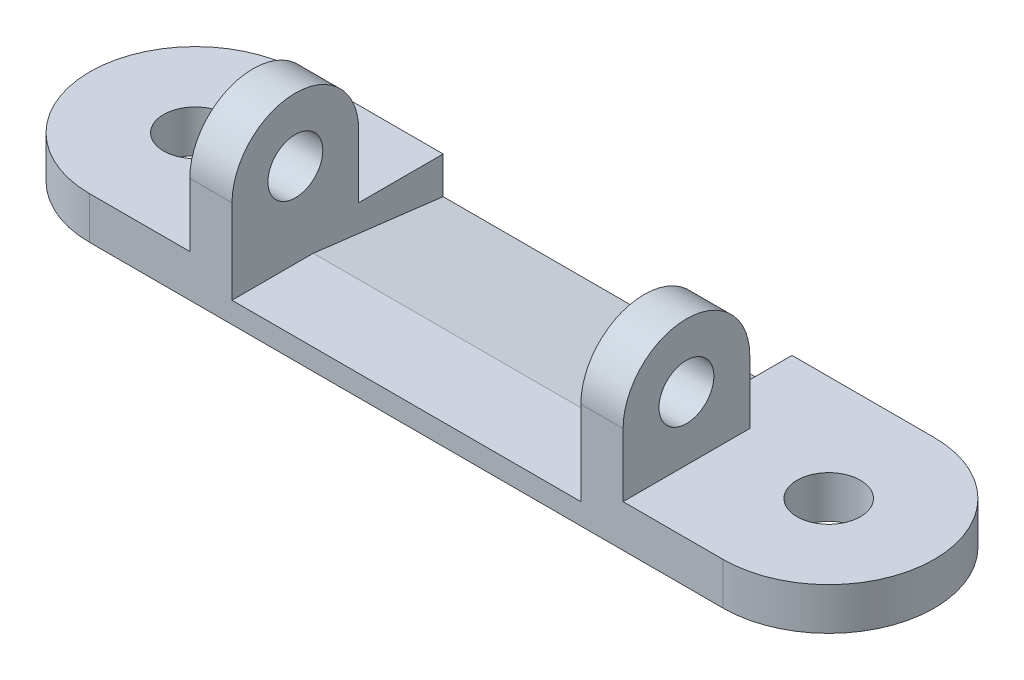
ISO-10303-21;
HEADER;
FILE_DESCRIPTION(('STEP AP214'),'2;1');
FILE_NAME('part.step','',(''),(''),'','','');
FILE_SCHEMA(('AUTOMOTIVE_DESIGN { 1 0 10303 214 1 1 1 1 }'));
ENDSEC;
DATA;
#1=APPLICATION_CONTEXT('core data for automotive mechanical design processes');
#2=APPLICATION_PROTOCOL_DEFINITION('international standard','automotive_design',2000,#1);
#3=PRODUCT_CONTEXT('',#1,'mechanical');
#4=PRODUCT('Part','Part','',(#3));
#5=PRODUCT_RELATED_PRODUCT_CATEGORY('part','',(#4));
#6=PRODUCT_DEFINITION_FORMATION('','',#4);
#7=PRODUCT_DEFINITION_CONTEXT('part definition',#1,'design');
#8=PRODUCT_DEFINITION('design','',#6,#7);
#9=PRODUCT_DEFINITION_SHAPE('','',#8);
#10=(LENGTH_UNIT() NAMED_UNIT(*) SI_UNIT(.MILLI.,.METRE.));
#11=(NAMED_UNIT(*) PLANE_ANGLE_UNIT() SI_UNIT($,.RADIAN.));
#12=(NAMED_UNIT(*) SI_UNIT($,.STERADIAN.) SOLID_ANGLE_UNIT());
#13=UNCERTAINTY_MEASURE_WITH_UNIT(LENGTH_MEASURE(1.E-05),#10,'distance_accuracy_value','');
#14=(GEOMETRIC_REPRESENTATION_CONTEXT(3) GLOBAL_UNCERTAINTY_ASSIGNED_CONTEXT((#13)) GLOBAL_UNIT_ASSIGNED_CONTEXT((#10,
#11,#12)) REPRESENTATION_CONTEXT('',''));
#15=CARTESIAN_POINT('',(0.,0.,0.));
#16=DIRECTION('',(0.,0.,1.));
#17=DIRECTION('',(1.,0.,0.));
#18=AXIS2_PLACEMENT_3D('',#15,#16,#17);
#19=CARTESIAN_POINT('',(20.5227116418583,-16.2835569799683,4.));
#20=DIRECTION('',(-1.,0.,0.));
#21=DIRECTION('',(0.,0.,1.));
#22=AXIS2_PLACEMENT_3D('',#19,#20,#21);
#23=PLANE('',#22);
#24=DIRECTION('',(0.,0.,1.));
#25=VECTOR('',#24,1.);
#26=CARTESIAN_POINT('',(20.5227116418583,4.,9.99999999999999));
#27=LINE('',#26,#25);
#28=CARTESIAN_POINT('',(20.5227116418583,4.,-2.00000000000001));
#29=VERTEX_POINT('',#28);
#30=CARTESIAN_POINT('',(20.5227116418583,4.,9.99999999999999));
#31=VERTEX_POINT('',#30);
#32=EDGE_CURVE('E211',#29,#31,#27,.T.);
#33=ORIENTED_EDGE('',*,*,#32,.F.);
#34=DIRECTION('',(0.,-1.,0.));
#35=VECTOR('',#34,1.);
#36=CARTESIAN_POINT('',(20.5227116418583,4.,-2.00000000000001));
#37=LINE('',#36,#35);
#38=CARTESIAN_POINT('',(20.5227116418583,10.,-2.00000000000001));
#39=VERTEX_POINT('',#38);
#40=EDGE_CURVE('E226',#39,#29,#37,.T.);
#41=ORIENTED_EDGE('',*,*,#40,.F.);
#42=CARTESIAN_POINT('',(20.5227116418583,10.,3.99999999999999));
#43=DIRECTION('',(-1.,0.,0.));
#44=DIRECTION('',(0.,0.,1.));
#45=AXIS2_PLACEMENT_3D('',#42,#43,#44);
#46=CIRCLE('',#45,6.);
#47=CARTESIAN_POINT('',(20.5227116418583,10.,9.99999999999999));
#48=VERTEX_POINT('',#47);
#49=EDGE_CURVE('E194',#48,#39,#46,.T.);
#50=ORIENTED_EDGE('',*,*,#49,.F.);
#51=DIRECTION('',(0.,1.,0.));
#52=VECTOR('',#51,1.);
#53=CARTESIAN_POINT('',(20.5227116418583,4.,9.99999999999999));
#54=LINE('',#53,#52);
#55=EDGE_CURVE('E197',#31,#48,#54,.T.);
#56=ORIENTED_EDGE('',*,*,#55,.F.);
#57=EDGE_LOOP('',(#33,#41,#50,#56));
#58=FACE_BOUND('',#57,.T.);
#59=CARTESIAN_POINT('',(20.5227116418583,10.,3.99999999999999));
#60=DIRECTION('',(-1.,0.,0.));
#61=DIRECTION('',(0.,0.,1.));
#62=AXIS2_PLACEMENT_3D('',#59,#60,#61);
#63=CIRCLE('',#62,2.6);
#64=CARTESIAN_POINT('',(20.5227116418583,10.,6.59999999999999));
#65=VERTEX_POINT('',#64);
#66=EDGE_CURVE('E191',#65,#65,#63,.F.);
#67=ORIENTED_EDGE('',*,*,#66,.F.);
#68=EDGE_LOOP('',(#67));
#69=FACE_BOUND('',#68,.T.);
#70=ADVANCED_FACE('F37',(#58,#69),#23,.F.);
#71=CARTESIAN_POINT('',(16.5227116418583,-16.2835569799683,4.));
#72=DIRECTION('',(-1.,0.,0.));
#73=DIRECTION('',(0.,0.,1.));
#74=AXIS2_PLACEMENT_3D('',#71,#72,#73);
#75=PLANE('',#74);
#76=DIRECTION('',(0.,-1.,0.));
#77=VECTOR('',#76,1.);
#78=CARTESIAN_POINT('',(16.5227116418583,4.,-2.00000000000001));
#79=LINE('',#78,#77);
#80=CARTESIAN_POINT('',(16.5227116418583,10.,-2.00000000000001));
#81=VERTEX_POINT('',#80);
#82=CARTESIAN_POINT('',(16.5227116418583,4.,-2.00000000000001));
#83=VERTEX_POINT('',#82);
#84=EDGE_CURVE('E222',#81,#83,#79,.T.);
#85=ORIENTED_EDGE('',*,*,#84,.T.);
#86=DIRECTION('',(0.,0.,1.));
#87=VECTOR('',#86,1.);
#88=CARTESIAN_POINT('',(16.5227116418583,4.,0.));
#89=LINE('',#88,#87);
#90=CARTESIAN_POINT('',(16.5227116418583,4.,-10.));
#91=VERTEX_POINT('',#90);
#92=EDGE_CURVE('E175',#91,#83,#89,.T.);
#93=ORIENTED_EDGE('',*,*,#92,.F.);
#94=DIRECTION('',(0.,1.,0.));
#95=VECTOR('',#94,1.);
#96=CARTESIAN_POINT('',(16.5227116418583,4.,-10.));
#97=LINE('',#96,#95);
#98=CARTESIAN_POINT('',(16.5227116418583,0.5,-10.));
#99=VERTEX_POINT('',#98);
#100=EDGE_CURVE('E181',#99,#91,#97,.T.);
#101=ORIENTED_EDGE('',*,*,#100,.F.);
#102=DIRECTION('',(0.,0.12105437531104,0.992645877550526));
#103=VECTOR('',#102,1.);
#104=CARTESIAN_POINT('',(16.5227116418583,2.,2.29999999999999));
#105=LINE('',#104,#103);
#106=CARTESIAN_POINT('',(16.5227116418583,2.,2.29999999999999));
#107=VERTEX_POINT('',#106);
#108=EDGE_CURVE('E161',#99,#107,#105,.T.);
#109=ORIENTED_EDGE('',*,*,#108,.T.);
#110=DIRECTION('',(0.,0.,1.));
#111=VECTOR('',#110,1.);
#112=CARTESIAN_POINT('',(16.5227116418583,2.,9.99999999999999));
#113=LINE('',#112,#111);
#114=CARTESIAN_POINT('',(16.5227116418583,2.,9.99999999999999));
#115=VERTEX_POINT('',#114);
#116=EDGE_CURVE('E170',#107,#115,#113,.T.);
#117=ORIENTED_EDGE('',*,*,#116,.T.);
#118=DIRECTION('',(0.,1.,0.));
#119=VECTOR('',#118,1.);
#120=CARTESIAN_POINT('',(16.5227116418583,4.,9.99999999999999));
#121=LINE('',#120,#119);
#122=CARTESIAN_POINT('',(16.5227116418583,10.,9.99999999999999));
#123=VERTEX_POINT('',#122);
#124=EDGE_CURVE('E195',#115,#123,#121,.T.);
#125=ORIENTED_EDGE('',*,*,#124,.T.);
#126=CARTESIAN_POINT('',(16.5227116418583,10.,3.99999999999999));
#127=DIRECTION('',(-1.,0.,0.));
#128=DIRECTION('',(0.,0.,1.));
#129=AXIS2_PLACEMENT_3D('',#126,#127,#128);
#130=CIRCLE('',#129,6.);
#131=EDGE_CURVE('E203',#123,#81,#130,.T.);
#132=ORIENTED_EDGE('',*,*,#131,.T.);
#133=EDGE_LOOP('',(#85,#93,#101,#109,#117,#125,#132));
#134=FACE_BOUND('',#133,.T.);
#135=CARTESIAN_POINT('',(16.5227116418583,10.,3.99999999999999));
#136=DIRECTION('',(1.,0.,0.));
#137=DIRECTION('',(0.,0.,-1.));
#138=AXIS2_PLACEMENT_3D('',#135,#136,#137);
#139=CIRCLE('',#138,2.6);
#140=CARTESIAN_POINT('',(16.5227116418583,10.,1.4));
#141=VERTEX_POINT('',#140);
#142=EDGE_CURVE('E188',#141,#141,#139,.T.);
#143=ORIENTED_EDGE('',*,*,#142,.T.);
#144=EDGE_LOOP('',(#143));
#145=FACE_BOUND('',#144,.T.);
#146=ADVANCED_FACE('F179',(#134,#145),#75,.T.);
#147=CARTESIAN_POINT('',(30.,4.,0.));
#148=DIRECTION('',(0.,-1.,0.));
#149=DIRECTION('',(0.,0.,-1.));
#150=AXIS2_PLACEMENT_3D('',#147,#148,#149);
#151=PLANE('',#150);
#152=CARTESIAN_POINT('',(30.,4.,0.));
#153=DIRECTION('',(0.,1.,0.));
#154=DIRECTION('',(0.,0.,1.));
#155=AXIS2_PLACEMENT_3D('',#152,#153,#154);
#156=CIRCLE('',#155,3.);
#157=CARTESIAN_POINT('',(30.,4.,2.99999999999999));
#158=VERTEX_POINT('',#157);
#159=EDGE_CURVE('E259',#158,#158,#156,.T.);
#160=ORIENTED_EDGE('',*,*,#159,.F.);
#161=EDGE_LOOP('',(#160));
#162=FACE_BOUND('',#161,.T.);
#163=DIRECTION('',(-1.,0.,0.));
#164=VECTOR('',#163,1.);
#165=CARTESIAN_POINT('',(-30.,4.,-10.));
#166=LINE('',#165,#164);
#167=CARTESIAN_POINT('',(30.,4.,-10.));
#168=VERTEX_POINT('',#167);
#169=EDGE_CURVE('E90',#168,#91,#166,.T.);
#170=ORIENTED_EDGE('',*,*,#169,.T.);
#171=ORIENTED_EDGE('',*,*,#92,.T.);
#172=DIRECTION('',(1.,0.,0.));
#173=VECTOR('',#172,1.);
#174=CARTESIAN_POINT('',(16.5227116418583,4.,-2.00000000000001));
#175=LINE('',#174,#173);
#176=EDGE_CURVE('E55',#83,#29,#175,.T.);
#177=ORIENTED_EDGE('',*,*,#176,.T.);
#178=ORIENTED_EDGE('',*,*,#32,.T.);
#179=DIRECTION('',(1.,0.,0.));
#180=VECTOR('',#179,1.);
#181=CARTESIAN_POINT('',(-30.,4.,9.99999999999999));
#182=LINE('',#181,#180);
#183=CARTESIAN_POINT('',(30.,4.,9.99999999999999));
#184=VERTEX_POINT('',#183);
#185=EDGE_CURVE('E41',#31,#184,#182,.T.);
#186=ORIENTED_EDGE('',*,*,#185,.T.);
#187=CARTESIAN_POINT('',(30.,4.,0.));
#188=DIRECTION('',(0.,1.,0.));
#189=DIRECTION('',(0.,0.,-1.));
#190=AXIS2_PLACEMENT_3D('',#187,#188,#189);
#191=CIRCLE('',#190,10.);
#192=EDGE_CURVE('E314',#184,#168,#191,.T.);
#193=ORIENTED_EDGE('',*,*,#192,.T.);
#194=EDGE_LOOP('',(#170,#171,#177,#178,#186,#193));
#195=FACE_BOUND('',#194,.T.);
#196=ADVANCED_FACE('F362',(#162,#195),#151,.F.);
#197=CARTESIAN_POINT('',(-30.,4.,0.));
#198=DIRECTION('',(0.,1.,0.));
#199=DIRECTION('',(0.,0.,1.));
#200=AXIS2_PLACEMENT_3D('',#197,#198,#199);
#201=CIRCLE('',#200,3.);
#202=CARTESIAN_POINT('',(-30.,4.,2.99999999999999));
#203=VERTEX_POINT('',#202);
#204=EDGE_CURVE('E305',#203,#203,#201,.T.);
#205=ORIENTED_EDGE('',*,*,#204,.F.);
#206=EDGE_LOOP('',(#205));
#207=FACE_BOUND('',#206,.T.);
#208=DIRECTION('',(-1.,0.,0.));
#209=VECTOR('',#208,1.);
#210=CARTESIAN_POINT('',(-16.5227116418583,4.,-2.00000000000001));
#211=LINE('',#210,#209);
#212=CARTESIAN_POINT('',(-16.5227116418583,4.,-2.00000000000001));
#213=VERTEX_POINT('',#212);
#214=CARTESIAN_POINT('',(-20.5227116418583,4.,-2.00000000000001));
#215=VERTEX_POINT('',#214);
#216=EDGE_CURVE('E275',#213,#215,#211,.T.);
#217=ORIENTED_EDGE('',*,*,#216,.F.);
#218=DIRECTION('',(0.,0.,-1.));
#219=VECTOR('',#218,1.);
#220=CARTESIAN_POINT('',(-16.5227116418583,4.,0.));
#221=LINE('',#220,#219);
#222=CARTESIAN_POINT('',(-16.5227116418583,4.,-10.));
#223=VERTEX_POINT('',#222);
#224=EDGE_CURVE('E239',#213,#223,#221,.T.);
#225=ORIENTED_EDGE('',*,*,#224,.T.);
#226=CARTESIAN_POINT('',(-30.,4.,-10.));
#227=VERTEX_POINT('',#226);
#228=EDGE_CURVE('E316',#223,#227,#166,.T.);
#229=ORIENTED_EDGE('',*,*,#228,.T.);
#230=CARTESIAN_POINT('',(-30.,4.,0.));
#231=DIRECTION('',(0.,1.,0.));
#232=DIRECTION('',(0.,0.,1.));
#233=AXIS2_PLACEMENT_3D('',#230,#231,#232);
#234=CIRCLE('',#233,10.);
#235=CARTESIAN_POINT('',(-30.,4.,9.99999999999999));
#236=VERTEX_POINT('',#235);
#237=EDGE_CURVE('E318',#227,#236,#234,.T.);
#238=ORIENTED_EDGE('',*,*,#237,.T.);
#239=CARTESIAN_POINT('',(-20.5227116418583,4.,9.99999999999999));
#240=VERTEX_POINT('',#239);
#241=EDGE_CURVE('E323',#236,#240,#182,.T.);
#242=ORIENTED_EDGE('',*,*,#241,.T.);
#243=DIRECTION('',(0.,0.,1.));
#244=VECTOR('',#243,1.);
#245=CARTESIAN_POINT('',(-20.5227116418583,4.,9.99999999999999));
#246=LINE('',#245,#244);
#247=EDGE_CURVE('E255',#215,#240,#246,.T.);
#248=ORIENTED_EDGE('',*,*,#247,.F.);
#249=EDGE_LOOP('',(#217,#225,#229,#238,#242,#248));
#250=FACE_BOUND('',#249,.T.);
#251=ADVANCED_FACE('F355',(#207,#250),#151,.F.);
#252=CARTESIAN_POINT('',(30.,4.,0.));
#253=DIRECTION('',(0.,-1.,0.));
#254=DIRECTION('',(0.,0.,-1.));
#255=AXIS2_PLACEMENT_3D('',#252,#253,#254);
#256=CYLINDRICAL_SURFACE('',#255,10.);
#257=CARTESIAN_POINT('',(30.,0.,0.));
#258=DIRECTION('',(0.,1.,0.));
#259=DIRECTION('',(0.,0.,-1.));
#260=AXIS2_PLACEMENT_3D('',#257,#258,#259);
#261=CIRCLE('',#260,10.);
#262=CARTESIAN_POINT('',(30.,0.,9.99999999999999));
#263=VERTEX_POINT('',#262);
#264=CARTESIAN_POINT('',(30.,0.,-10.));
#265=VERTEX_POINT('',#264);
#266=EDGE_CURVE('E311',#263,#265,#261,.T.);
#267=ORIENTED_EDGE('',*,*,#266,.T.);
#268=DIRECTION('',(0.,-1.,0.));
#269=VECTOR('',#268,1.);
#270=CARTESIAN_POINT('',(30.,4.,-10.));
#271=LINE('',#270,#269);
#272=EDGE_CURVE('E12',#168,#265,#271,.T.);
#273=ORIENTED_EDGE('',*,*,#272,.F.);
#274=ORIENTED_EDGE('',*,*,#192,.F.);
#275=DIRECTION('',(0.,-1.,0.));
#276=VECTOR('',#275,1.);
#277=CARTESIAN_POINT('',(30.,4.,9.99999999999999));
#278=LINE('',#277,#276);
#279=EDGE_CURVE('E325',#184,#263,#278,.T.);
#280=ORIENTED_EDGE('',*,*,#279,.T.);
#281=EDGE_LOOP('',(#267,#273,#274,#280));
#282=FACE_BOUND('',#281,.T.);
#283=ADVANCED_FACE('F39',(#282),#256,.T.);
#284=CARTESIAN_POINT('',(-30.,4.,-10.));
#285=DIRECTION('',(0.,0.,1.));
#286=DIRECTION('',(1.,0.,0.));
#287=AXIS2_PLACEMENT_3D('',#284,#285,#286);
#288=PLANE('',#287);
#289=DIRECTION('',(-1.,0.,0.));
#290=VECTOR('',#289,1.);
#291=CARTESIAN_POINT('',(-30.,0.,-10.));
#292=LINE('',#291,#290);
#293=CARTESIAN_POINT('',(-30.,0.,-10.));
#294=VERTEX_POINT('',#293);
#295=EDGE_CURVE('E334',#265,#294,#292,.T.);
#296=ORIENTED_EDGE('',*,*,#295,.T.);
#297=DIRECTION('',(0.,-1.,0.));
#298=VECTOR('',#297,1.);
#299=CARTESIAN_POINT('',(-30.,4.,-10.));
#300=LINE('',#299,#298);
#301=EDGE_CURVE('E47',#227,#294,#300,.T.);
#302=ORIENTED_EDGE('',*,*,#301,.F.);
#303=ORIENTED_EDGE('',*,*,#228,.F.);
#304=DIRECTION('',(0.,-1.,0.));
#305=VECTOR('',#304,1.);
#306=CARTESIAN_POINT('',(-16.5227116418583,4.,-10.));
#307=LINE('',#306,#305);
#308=CARTESIAN_POINT('',(-16.5227116418583,0.5,-10.));
#309=VERTEX_POINT('',#308);
#310=EDGE_CURVE('E244',#223,#309,#307,.T.);
#311=ORIENTED_EDGE('',*,*,#310,.T.);
#312=DIRECTION('',(1.,0.,0.));
#313=VECTOR('',#312,1.);
#314=CARTESIAN_POINT('',(-44.3746652782319,0.5,-10.));
#315=LINE('',#314,#313);
#316=EDGE_CURVE('E165',#309,#99,#315,.T.);
#317=ORIENTED_EDGE('',*,*,#316,.T.);
#318=ORIENTED_EDGE('',*,*,#100,.T.);
#319=ORIENTED_EDGE('',*,*,#169,.F.);
#320=ORIENTED_EDGE('',*,*,#272,.T.);
#321=EDGE_LOOP('',(#296,#302,#303,#311,#317,#318,#319,#320));
#322=FACE_BOUND('',#321,.T.);
#323=ADVANCED_FACE('F345',(#322),#288,.F.);
#324=CARTESIAN_POINT('',(-30.,4.,0.));
#325=DIRECTION('',(0.,-1.,0.));
#326=DIRECTION('',(0.,0.,-1.));
#327=AXIS2_PLACEMENT_3D('',#324,#325,#326);
#328=CYLINDRICAL_SURFACE('',#327,10.);
#329=CARTESIAN_POINT('',(-30.,0.,0.));
#330=DIRECTION('',(0.,1.,0.));
#331=DIRECTION('',(0.,0.,1.));
#332=AXIS2_PLACEMENT_3D('',#329,#330,#331);
#333=CIRCLE('',#332,10.);
#334=CARTESIAN_POINT('',(-30.,0.,9.99999999999999));
#335=VERTEX_POINT('',#334);
#336=EDGE_CURVE('E333',#294,#335,#333,.T.);
#337=ORIENTED_EDGE('',*,*,#336,.T.);
#338=DIRECTION('',(0.,-1.,0.));
#339=VECTOR('',#338,1.);
#340=CARTESIAN_POINT('',(-30.,4.,9.99999999999999));
#341=LINE('',#340,#339);
#342=EDGE_CURVE('E329',#236,#335,#341,.T.);
#343=ORIENTED_EDGE('',*,*,#342,.F.);
#344=ORIENTED_EDGE('',*,*,#237,.F.);
#345=ORIENTED_EDGE('',*,*,#301,.T.);
#346=EDGE_LOOP('',(#337,#343,#344,#345));
#347=FACE_BOUND('',#346,.T.);
#348=ADVANCED_FACE('F347',(#347),#328,.T.);
#349=CARTESIAN_POINT('',(-30.,4.,9.99999999999999));
#350=DIRECTION('',(0.,0.,-1.));
#351=DIRECTION('',(-1.,0.,0.));
#352=AXIS2_PLACEMENT_3D('',#349,#350,#351);
#353=PLANE('',#352);
#354=ORIENTED_EDGE('',*,*,#124,.F.);
#355=DIRECTION('',(1.,0.,0.));
#356=VECTOR('',#355,1.);
#357=CARTESIAN_POINT('',(-44.3746652782319,2.,9.99999999999999));
#358=LINE('',#357,#356);
#359=CARTESIAN_POINT('',(-16.5227116418583,2.,9.99999999999999));
#360=VERTEX_POINT('',#359);
#361=EDGE_CURVE('E166',#360,#115,#358,.T.);
#362=ORIENTED_EDGE('',*,*,#361,.F.);
#363=DIRECTION('',(0.,1.,0.));
#364=VECTOR('',#363,1.);
#365=CARTESIAN_POINT('',(-16.5227116418583,4.,9.99999999999999));
#366=LINE('',#365,#364);
#367=CARTESIAN_POINT('',(-16.5227116418583,10.,9.99999999999999));
#368=VERTEX_POINT('',#367);
#369=EDGE_CURVE('E256',#360,#368,#366,.T.);
#370=ORIENTED_EDGE('',*,*,#369,.T.);
#371=DIRECTION('',(-1.,0.,0.));
#372=VECTOR('',#371,1.);
#373=CARTESIAN_POINT('',(-16.5227116418583,10.,9.99999999999999));
#374=LINE('',#373,#372);
#375=CARTESIAN_POINT('',(-20.5227116418583,10.,9.99999999999999));
#376=VERTEX_POINT('',#375);
#377=EDGE_CURVE('E263',#368,#376,#374,.T.);
#378=ORIENTED_EDGE('',*,*,#377,.T.);
#379=DIRECTION('',(0.,1.,0.));
#380=VECTOR('',#379,1.);
#381=CARTESIAN_POINT('',(-20.5227116418583,4.,9.99999999999999));
#382=LINE('',#381,#380);
#383=EDGE_CURVE('E260',#240,#376,#382,.T.);
#384=ORIENTED_EDGE('',*,*,#383,.F.);
#385=ORIENTED_EDGE('',*,*,#241,.F.);
#386=ORIENTED_EDGE('',*,*,#342,.T.);
#387=DIRECTION('',(1.,0.,0.));
#388=VECTOR('',#387,1.);
#389=CARTESIAN_POINT('',(-30.,0.,9.99999999999999));
#390=LINE('',#389,#388);
#391=EDGE_CURVE('E83',#335,#263,#390,.T.);
#392=ORIENTED_EDGE('',*,*,#391,.T.);
#393=ORIENTED_EDGE('',*,*,#279,.F.);
#394=ORIENTED_EDGE('',*,*,#185,.F.);
#395=ORIENTED_EDGE('',*,*,#55,.T.);
#396=DIRECTION('',(1.,0.,0.));
#397=VECTOR('',#396,1.);
#398=CARTESIAN_POINT('',(16.5227116418583,10.,9.99999999999999));
#399=LINE('',#398,#397);
#400=EDGE_CURVE('E200',#123,#48,#399,.T.);
#401=ORIENTED_EDGE('',*,*,#400,.F.);
#402=EDGE_LOOP('',(#354,#362,#370,#378,#384,#385,#386,#392,#393,#394,#395,#401));
#403=FACE_BOUND('',#402,.T.);
#404=ADVANCED_FACE('F352',(#403),#353,.F.);
#405=CARTESIAN_POINT('',(30.,0.,0.));
#406=DIRECTION('',(0.,-1.,0.));
#407=DIRECTION('',(0.,0.,-1.));
#408=AXIS2_PLACEMENT_3D('',#405,#406,#407);
#409=PLANE('',#408);
#410=ORIENTED_EDGE('',*,*,#266,.F.);
#411=ORIENTED_EDGE('',*,*,#391,.F.);
#412=ORIENTED_EDGE('',*,*,#336,.F.);
#413=ORIENTED_EDGE('',*,*,#295,.F.);
#414=EDGE_LOOP('',(#410,#411,#412,#413));
#415=FACE_BOUND('',#414,.T.);
#416=CARTESIAN_POINT('',(30.,0.,0.));
#417=DIRECTION('',(0.,1.,0.));
#418=DIRECTION('',(0.,0.,1.));
#419=AXIS2_PLACEMENT_3D('',#416,#417,#418);
#420=CIRCLE('',#419,3.);
#421=CARTESIAN_POINT('',(30.,0.,2.99999999999999));
#422=VERTEX_POINT('',#421);
#423=EDGE_CURVE('E302',#422,#422,#420,.T.);
#424=ORIENTED_EDGE('',*,*,#423,.T.);
#425=EDGE_LOOP('',(#424));
#426=FACE_BOUND('',#425,.T.);
#427=CARTESIAN_POINT('',(-30.,0.,0.));
#428=DIRECTION('',(0.,1.,0.));
#429=DIRECTION('',(0.,0.,1.));
#430=AXIS2_PLACEMENT_3D('',#427,#428,#429);
#431=CIRCLE('',#430,3.);
#432=CARTESIAN_POINT('',(-30.,0.,2.99999999999999));
#433=VERTEX_POINT('',#432);
#434=EDGE_CURVE('E308',#433,#433,#431,.T.);
#435=ORIENTED_EDGE('',*,*,#434,.T.);
#436=EDGE_LOOP('',(#435));
#437=FACE_BOUND('',#436,.T.);
#438=ADVANCED_FACE('F342',(#415,#426,#437),#409,.T.);
#439=CARTESIAN_POINT('',(-30.,0.,0.));
#440=DIRECTION('',(0.,1.,0.));
#441=DIRECTION('',(0.,0.,1.));
#442=AXIS2_PLACEMENT_3D('',#439,#440,#441);
#443=CYLINDRICAL_SURFACE('',#442,3.);
#444=ORIENTED_EDGE('',*,*,#434,.F.);
#445=EDGE_LOOP('',(#444));
#446=FACE_BOUND('',#445,.T.);
#447=ORIENTED_EDGE('',*,*,#204,.T.);
#448=EDGE_LOOP('',(#447));
#449=FACE_BOUND('',#448,.T.);
#450=ADVANCED_FACE('F397',(#446,#449),#443,.F.);
#451=CARTESIAN_POINT('',(30.,0.,0.));
#452=DIRECTION('',(0.,1.,0.));
#453=DIRECTION('',(0.,0.,1.));
#454=AXIS2_PLACEMENT_3D('',#451,#452,#453);
#455=CYLINDRICAL_SURFACE('',#454,3.);
#456=ORIENTED_EDGE('',*,*,#423,.F.);
#457=EDGE_LOOP('',(#456));
#458=FACE_BOUND('',#457,.T.);
#459=ORIENTED_EDGE('',*,*,#159,.T.);
#460=EDGE_LOOP('',(#459));
#461=FACE_BOUND('',#460,.T.);
#462=ADVANCED_FACE('F388',(#458,#461),#455,.F.);
#463=CARTESIAN_POINT('',(-20.5227116418583,-16.2835569799683,4.));
#464=DIRECTION('',(-1.,0.,0.));
#465=DIRECTION('',(0.,0.,1.));
#466=AXIS2_PLACEMENT_3D('',#463,#464,#465);
#467=PLANE('',#466);
#468=CARTESIAN_POINT('',(-20.5227116418583,10.,3.99999999999999));
#469=DIRECTION('',(-1.,0.,0.));
#470=DIRECTION('',(0.,0.,1.));
#471=AXIS2_PLACEMENT_3D('',#468,#469,#470);
#472=CIRCLE('',#471,2.6);
#473=CARTESIAN_POINT('',(-20.5227116418583,10.,6.59999999999999));
#474=VERTEX_POINT('',#473);
#475=EDGE_CURVE('E252',#474,#474,#472,.T.);
#476=ORIENTED_EDGE('',*,*,#475,.F.);
#477=EDGE_LOOP('',(#476));
#478=FACE_BOUND('',#477,.T.);
#479=ORIENTED_EDGE('',*,*,#247,.T.);
#480=ORIENTED_EDGE('',*,*,#383,.T.);
#481=CARTESIAN_POINT('',(-20.5227116418583,10.,3.99999999999999));
#482=DIRECTION('',(-1.,0.,0.));
#483=DIRECTION('',(0.,0.,1.));
#484=AXIS2_PLACEMENT_3D('',#481,#482,#483);
#485=CIRCLE('',#484,6.);
#486=CARTESIAN_POINT('',(-20.5227116418583,10.,-2.00000000000001));
#487=VERTEX_POINT('',#486);
#488=EDGE_CURVE('E267',#376,#487,#485,.T.);
#489=ORIENTED_EDGE('',*,*,#488,.T.);
#490=DIRECTION('',(0.,-1.,0.));
#491=VECTOR('',#490,1.);
#492=CARTESIAN_POINT('',(-20.5227116418583,4.,-2.00000000000001));
#493=LINE('',#492,#491);
#494=EDGE_CURVE('E288',#487,#215,#493,.T.);
#495=ORIENTED_EDGE('',*,*,#494,.T.);
#496=EDGE_LOOP('',(#479,#480,#489,#495));
#497=FACE_BOUND('',#496,.T.);
#498=ADVANCED_FACE('F379',(#478,#497),#467,.T.);
#499=CARTESIAN_POINT('',(-16.5227116418583,-16.2835569799683,4.));
#500=DIRECTION('',(-1.,0.,0.));
#501=DIRECTION('',(0.,0.,1.));
#502=AXIS2_PLACEMENT_3D('',#499,#500,#501);
#503=PLANE('',#502);
#504=CARTESIAN_POINT('',(-16.5227116418583,10.,3.99999999999999));
#505=DIRECTION('',(1.,0.,0.));
#506=DIRECTION('',(0.,0.,-1.));
#507=AXIS2_PLACEMENT_3D('',#504,#505,#506);
#508=CIRCLE('',#507,2.6);
#509=CARTESIAN_POINT('',(-16.5227116418583,10.,1.4));
#510=VERTEX_POINT('',#509);
#511=EDGE_CURVE('E249',#510,#510,#508,.T.);
#512=ORIENTED_EDGE('',*,*,#511,.F.);
#513=EDGE_LOOP('',(#512));
#514=FACE_BOUND('',#513,.T.);
#515=ORIENTED_EDGE('',*,*,#369,.F.);
#516=DIRECTION('',(0.,0.,1.));
#517=VECTOR('',#516,1.);
#518=CARTESIAN_POINT('',(-16.5227116418583,2.,9.99999999999999));
#519=LINE('',#518,#517);
#520=CARTESIAN_POINT('',(-16.5227116418583,2.,2.29999999999999));
#521=VERTEX_POINT('',#520);
#522=EDGE_CURVE('E236',#521,#360,#519,.T.);
#523=ORIENTED_EDGE('',*,*,#522,.F.);
#524=DIRECTION('',(0.,0.12105437531104,0.992645877550526));
#525=VECTOR('',#524,1.);
#526=CARTESIAN_POINT('',(-16.5227116418583,2.,2.29999999999999));
#527=LINE('',#526,#525);
#528=EDGE_CURVE('E162',#309,#521,#527,.T.);
#529=ORIENTED_EDGE('',*,*,#528,.F.);
#530=ORIENTED_EDGE('',*,*,#310,.F.);
#531=ORIENTED_EDGE('',*,*,#224,.F.);
#532=DIRECTION('',(0.,-1.,0.));
#533=VECTOR('',#532,1.);
#534=CARTESIAN_POINT('',(-16.5227116418583,4.,-2.00000000000001));
#535=LINE('',#534,#533);
#536=CARTESIAN_POINT('',(-16.5227116418583,10.,-2.00000000000001));
#537=VERTEX_POINT('',#536);
#538=EDGE_CURVE('E282',#537,#213,#535,.T.);
#539=ORIENTED_EDGE('',*,*,#538,.F.);
#540=CARTESIAN_POINT('',(-16.5227116418583,10.,3.99999999999999));
#541=DIRECTION('',(-1.,0.,0.));
#542=DIRECTION('',(0.,0.,1.));
#543=AXIS2_PLACEMENT_3D('',#540,#541,#542);
#544=CIRCLE('',#543,6.);
#545=EDGE_CURVE('E266',#368,#537,#544,.T.);
#546=ORIENTED_EDGE('',*,*,#545,.F.);
#547=EDGE_LOOP('',(#515,#523,#529,#530,#531,#539,#546));
#548=FACE_BOUND('',#547,.T.);
#549=ADVANCED_FACE('F383',(#514,#548),#503,.F.);
#550=CARTESIAN_POINT('',(-16.5227116418583,4.,-2.00000000000001));
#551=DIRECTION('',(0.,0.,-1.));
#552=DIRECTION('',(-1.,0.,0.));
#553=AXIS2_PLACEMENT_3D('',#550,#551,#552);
#554=PLANE('',#553);
#555=ORIENTED_EDGE('',*,*,#494,.F.);
#556=DIRECTION('',(-1.,0.,0.));
#557=VECTOR('',#556,1.);
#558=CARTESIAN_POINT('',(-16.5227116418583,10.,-2.00000000000001));
#559=LINE('',#558,#557);
#560=EDGE_CURVE('E285',#537,#487,#559,.T.);
#561=ORIENTED_EDGE('',*,*,#560,.F.);
#562=ORIENTED_EDGE('',*,*,#538,.T.);
#563=ORIENTED_EDGE('',*,*,#216,.T.);
#564=EDGE_LOOP('',(#555,#561,#562,#563));
#565=FACE_BOUND('',#564,.T.);
#566=ADVANCED_FACE('F380',(#565),#554,.T.);
#567=CARTESIAN_POINT('',(-16.5227116418583,10.,3.99999999999999));
#568=DIRECTION('',(-1.,0.,0.));
#569=DIRECTION('',(0.,0.,1.));
#570=AXIS2_PLACEMENT_3D('',#567,#568,#569);
#571=CYLINDRICAL_SURFACE('',#570,6.);
#572=ORIENTED_EDGE('',*,*,#488,.F.);
#573=ORIENTED_EDGE('',*,*,#377,.F.);
#574=ORIENTED_EDGE('',*,*,#545,.T.);
#575=ORIENTED_EDGE('',*,*,#560,.T.);
#576=EDGE_LOOP('',(#572,#573,#574,#575));
#577=FACE_BOUND('',#576,.T.);
#578=ADVANCED_FACE('F377',(#577),#571,.T.);
#579=CARTESIAN_POINT('',(-40.,10.,3.99999999999999));
#580=DIRECTION('',(1.,0.,0.));
#581=DIRECTION('',(0.,0.,-1.));
#582=AXIS2_PLACEMENT_3D('',#579,#580,#581);
#583=CYLINDRICAL_SURFACE('',#582,2.6);
#584=ORIENTED_EDGE('',*,*,#475,.T.);
#585=EDGE_LOOP('',(#584));
#586=FACE_BOUND('',#585,.T.);
#587=ORIENTED_EDGE('',*,*,#511,.T.);
#588=EDGE_LOOP('',(#587));
#589=FACE_BOUND('',#588,.T.);
#590=ADVANCED_FACE('F374',(#586,#589),#583,.F.);
#591=CARTESIAN_POINT('',(-44.3746652782319,2.,9.99999999999999));
#592=DIRECTION('',(0.,1.,0.));
#593=DIRECTION('',(0.,0.,1.));
#594=AXIS2_PLACEMENT_3D('',#591,#592,#593);
#595=PLANE('',#594);
#596=ORIENTED_EDGE('',*,*,#522,.T.);
#597=ORIENTED_EDGE('',*,*,#361,.T.);
#598=ORIENTED_EDGE('',*,*,#116,.F.);
#599=DIRECTION('',(1.,0.,0.));
#600=VECTOR('',#599,1.);
#601=CARTESIAN_POINT('',(-44.3746652782319,2.,2.29999999999999));
#602=LINE('',#601,#600);
#603=EDGE_CURVE('E156',#521,#107,#602,.T.);
#604=ORIENTED_EDGE('',*,*,#603,.F.);
#605=EDGE_LOOP('',(#596,#597,#598,#604));
#606=FACE_BOUND('',#605,.T.);
#607=ADVANCED_FACE('F171',(#606),#595,.T.);
#608=CARTESIAN_POINT('',(-44.3746652782319,2.,2.29999999999999));
#609=DIRECTION('',(0.,0.992645877550526,-0.12105437531104));
#610=DIRECTION('',(0.,0.12105437531104,0.992645877550526));
#611=AXIS2_PLACEMENT_3D('',#608,#609,#610);
#612=PLANE('',#611);
#613=ORIENTED_EDGE('',*,*,#528,.T.);
#614=ORIENTED_EDGE('',*,*,#603,.T.);
#615=ORIENTED_EDGE('',*,*,#108,.F.);
#616=ORIENTED_EDGE('',*,*,#316,.F.);
#617=EDGE_LOOP('',(#613,#614,#615,#616));
#618=FACE_BOUND('',#617,.T.);
#619=ADVANCED_FACE('F158',(#618),#612,.T.);
#620=CARTESIAN_POINT('',(16.5227116418583,10.,3.99999999999999));
#621=DIRECTION('',(1.,0.,0.));
#622=DIRECTION('',(0.,0.,-1.));
#623=AXIS2_PLACEMENT_3D('',#620,#621,#622);
#624=CYLINDRICAL_SURFACE('',#623,6.);
#625=ORIENTED_EDGE('',*,*,#49,.T.);
#626=DIRECTION('',(1.,0.,0.));
#627=VECTOR('',#626,1.);
#628=CARTESIAN_POINT('',(16.5227116418583,10.,-2.00000000000001));
#629=LINE('',#628,#627);
#630=EDGE_CURVE('E208',#81,#39,#629,.T.);
#631=ORIENTED_EDGE('',*,*,#630,.F.);
#632=ORIENTED_EDGE('',*,*,#131,.F.);
#633=ORIENTED_EDGE('',*,*,#400,.T.);
#634=EDGE_LOOP('',(#625,#631,#632,#633));
#635=FACE_BOUND('',#634,.T.);
#636=ADVANCED_FACE('F370',(#635),#624,.T.);
#637=CARTESIAN_POINT('',(16.5227116418583,4.,-2.00000000000001));
#638=DIRECTION('',(0.,0.,1.));
#639=DIRECTION('',(1.,0.,0.));
#640=AXIS2_PLACEMENT_3D('',#637,#638,#639);
#641=PLANE('',#640);
#642=ORIENTED_EDGE('',*,*,#40,.T.);
#643=ORIENTED_EDGE('',*,*,#176,.F.);
#644=ORIENTED_EDGE('',*,*,#84,.F.);
#645=ORIENTED_EDGE('',*,*,#630,.T.);
#646=EDGE_LOOP('',(#642,#643,#644,#645));
#647=FACE_BOUND('',#646,.T.);
#648=ADVANCED_FACE('F371',(#647),#641,.F.);
#649=CARTESIAN_POINT('',(40.,10.,3.99999999999999));
#650=DIRECTION('',(-1.,0.,0.));
#651=DIRECTION('',(0.,0.,1.));
#652=AXIS2_PLACEMENT_3D('',#649,#650,#651);
#653=CYLINDRICAL_SURFACE('',#652,2.6);
#654=ORIENTED_EDGE('',*,*,#142,.F.);
#655=EDGE_LOOP('',(#654));
#656=FACE_BOUND('',#655,.T.);
#657=ORIENTED_EDGE('',*,*,#66,.T.);
#658=EDGE_LOOP('',(#657));
#659=FACE_BOUND('',#658,.T.);
#660=ADVANCED_FACE('F495',(#656,#659),#653,.F.);
#661=CLOSED_SHELL('',(#70,#146,#196,#251,#283,#323,#348,#404,#438,#450,#462,#498,#549,#566,#578,
#590,#607,#619,#636,#648,#660));
#662=MANIFOLD_SOLID_BREP('B2',#661);
#663=ADVANCED_BREP_SHAPE_REPRESENTATION('',(#18,#662),#14);
#664=SHAPE_DEFINITION_REPRESENTATION(#9,#663);
ENDSEC;
END-ISO-10303-21;
